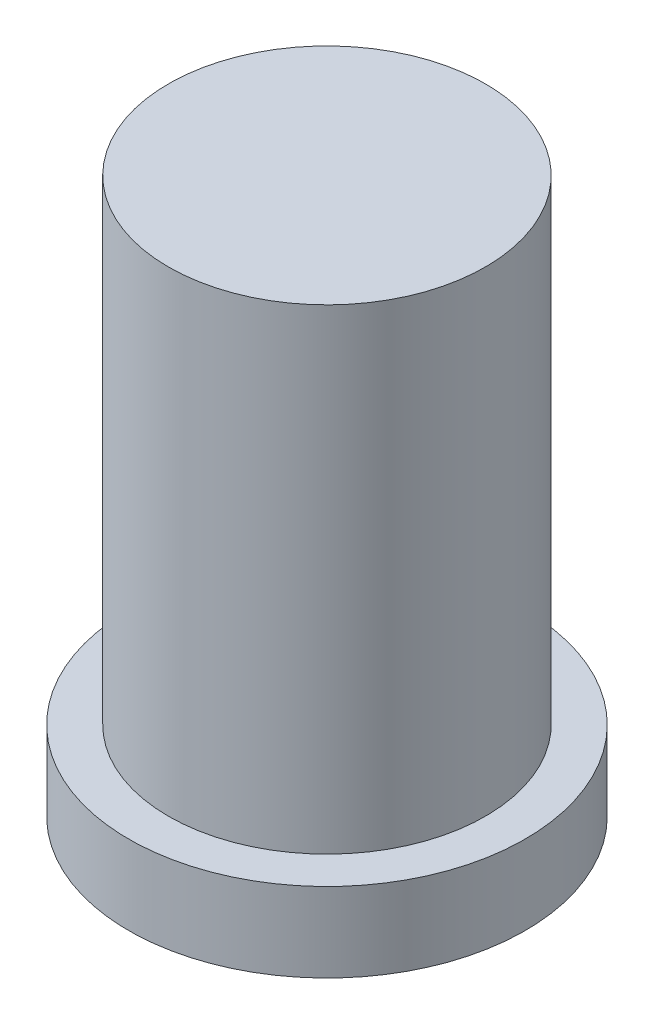
ISO-10303-21;
HEADER;
FILE_DESCRIPTION(('STEP AP214'),'2;1');
FILE_NAME('part.step','',(''),(''),'','','');
FILE_SCHEMA(('AUTOMOTIVE_DESIGN { 1 0 10303 214 1 1 1 1 }'));
ENDSEC;
DATA;
#1=APPLICATION_CONTEXT('core data for automotive mechanical design processes');
#2=APPLICATION_PROTOCOL_DEFINITION('international standard','automotive_design',2000,#1);
#3=PRODUCT_CONTEXT('',#1,'mechanical');
#4=PRODUCT('Part','Part','',(#3));
#5=PRODUCT_RELATED_PRODUCT_CATEGORY('part','',(#4));
#6=PRODUCT_DEFINITION_FORMATION('','',#4);
#7=PRODUCT_DEFINITION_CONTEXT('part definition',#1,'design');
#8=PRODUCT_DEFINITION('design','',#6,#7);
#9=PRODUCT_DEFINITION_SHAPE('','',#8);
#10=(LENGTH_UNIT() NAMED_UNIT(*) SI_UNIT(.MILLI.,.METRE.));
#11=(NAMED_UNIT(*) PLANE_ANGLE_UNIT() SI_UNIT($,.RADIAN.));
#12=(NAMED_UNIT(*) SI_UNIT($,.STERADIAN.) SOLID_ANGLE_UNIT());
#13=UNCERTAINTY_MEASURE_WITH_UNIT(LENGTH_MEASURE(1.E-05),#10,'distance_accuracy_value','');
#14=(GEOMETRIC_REPRESENTATION_CONTEXT(3) GLOBAL_UNCERTAINTY_ASSIGNED_CONTEXT((#13)) GLOBAL_UNIT_ASSIGNED_CONTEXT((#10,
#11,#12)) REPRESENTATION_CONTEXT('',''));
#15=CARTESIAN_POINT('',(0.,0.,0.));
#16=DIRECTION('',(0.,0.,1.));
#17=DIRECTION('',(1.,0.,0.));
#18=AXIS2_PLACEMENT_3D('',#15,#16,#17);
#19=CARTESIAN_POINT('',(0.,12.,0.));
#20=DIRECTION('',(0.,-1.,0.));
#21=DIRECTION('',(0.,0.,-1.));
#22=AXIS2_PLACEMENT_3D('',#19,#20,#21);
#23=CYLINDRICAL_SURFACE('',#22,4.);
#24=CARTESIAN_POINT('',(0.,12.,0.));
#25=DIRECTION('',(0.,1.,0.));
#26=DIRECTION('',(0.,0.,1.));
#27=AXIS2_PLACEMENT_3D('',#24,#25,#26);
#28=CIRCLE('',#27,4.);
#29=CARTESIAN_POINT('',(0.,12.,4.));
#30=VERTEX_POINT('',#29);
#31=EDGE_CURVE('E10',#30,#30,#28,.T.);
#32=ORIENTED_EDGE('',*,*,#31,.F.);
#33=EDGE_LOOP('',(#32));
#34=FACE_BOUND('',#33,.T.);
#35=CARTESIAN_POINT('',(0.,0.,0.));
#36=DIRECTION('',(0.,1.,0.));
#37=DIRECTION('',(0.,0.,1.));
#38=AXIS2_PLACEMENT_3D('',#35,#36,#37);
#39=CIRCLE('',#38,4.);
#40=CARTESIAN_POINT('',(0.,0.,4.));
#41=VERTEX_POINT('',#40);
#42=EDGE_CURVE('E40',#41,#41,#39,.T.);
#43=ORIENTED_EDGE('',*,*,#42,.T.);
#44=EDGE_LOOP('',(#43));
#45=FACE_BOUND('',#44,.T.);
#46=ADVANCED_FACE('F37',(#34,#45),#23,.T.);
#47=CARTESIAN_POINT('',(0.,12.,0.));
#48=DIRECTION('',(0.,1.,0.));
#49=DIRECTION('',(0.,0.,1.));
#50=AXIS2_PLACEMENT_3D('',#47,#48,#49);
#51=PLANE('',#50);
#52=ORIENTED_EDGE('',*,*,#31,.T.);
#53=EDGE_LOOP('',(#52));
#54=FACE_BOUND('',#53,.T.);
#55=ADVANCED_FACE('F64',(#54),#51,.T.);
#56=CARTESIAN_POINT('',(0.,-2.,0.));
#57=DIRECTION('',(0.,1.,0.));
#58=DIRECTION('',(0.,0.,1.));
#59=AXIS2_PLACEMENT_3D('',#56,#57,#58);
#60=CYLINDRICAL_SURFACE('',#59,5.);
#61=CARTESIAN_POINT('',(0.,-2.,0.));
#62=DIRECTION('',(0.,-1.,0.));
#63=DIRECTION('',(0.,0.,-1.));
#64=AXIS2_PLACEMENT_3D('',#61,#62,#63);
#65=CIRCLE('',#64,5.);
#66=CARTESIAN_POINT('',(0.,-2.,-5.));
#67=VERTEX_POINT('',#66);
#68=EDGE_CURVE('E49',#67,#67,#65,.T.);
#69=ORIENTED_EDGE('',*,*,#68,.F.);
#70=EDGE_LOOP('',(#69));
#71=FACE_BOUND('',#70,.T.);
#72=CARTESIAN_POINT('',(0.,0.,0.));
#73=DIRECTION('',(0.,-1.,0.));
#74=DIRECTION('',(0.,0.,-1.));
#75=AXIS2_PLACEMENT_3D('',#72,#73,#74);
#76=CIRCLE('',#75,5.);
#77=CARTESIAN_POINT('',(0.,0.,-5.));
#78=VERTEX_POINT('',#77);
#79=EDGE_CURVE('E51',#78,#78,#76,.T.);
#80=ORIENTED_EDGE('',*,*,#79,.T.);
#81=EDGE_LOOP('',(#80));
#82=FACE_BOUND('',#81,.T.);
#83=ADVANCED_FACE('F61',(#71,#82),#60,.T.);
#84=CARTESIAN_POINT('',(0.,-2.,0.));
#85=DIRECTION('',(0.,-1.,0.));
#86=DIRECTION('',(0.,0.,-1.));
#87=AXIS2_PLACEMENT_3D('',#84,#85,#86);
#88=PLANE('',#87);
#89=ORIENTED_EDGE('',*,*,#68,.T.);
#90=EDGE_LOOP('',(#89));
#91=FACE_BOUND('',#90,.T.);
#92=ADVANCED_FACE('F59',(#91),#88,.T.);
#93=CARTESIAN_POINT('',(0.,0.,0.));
#94=DIRECTION('',(0.,-1.,0.));
#95=DIRECTION('',(0.,0.,-1.));
#96=AXIS2_PLACEMENT_3D('',#93,#94,#95);
#97=PLANE('',#96);
#98=ORIENTED_EDGE('',*,*,#42,.F.);
#99=EDGE_LOOP('',(#98));
#100=FACE_BOUND('',#99,.T.);
#101=ORIENTED_EDGE('',*,*,#79,.F.);
#102=EDGE_LOOP('',(#101));
#103=FACE_BOUND('',#102,.T.);
#104=ADVANCED_FACE('F68',(#100,#103),#97,.F.);
#105=CLOSED_SHELL('',(#46,#55,#83,#92,#104));
#106=MANIFOLD_SOLID_BREP('B2',#105);
#107=ADVANCED_BREP_SHAPE_REPRESENTATION('',(#18,#106),#14);
#108=SHAPE_DEFINITION_REPRESENTATION(#9,#107);
ENDSEC;
END-ISO-10303-21;
